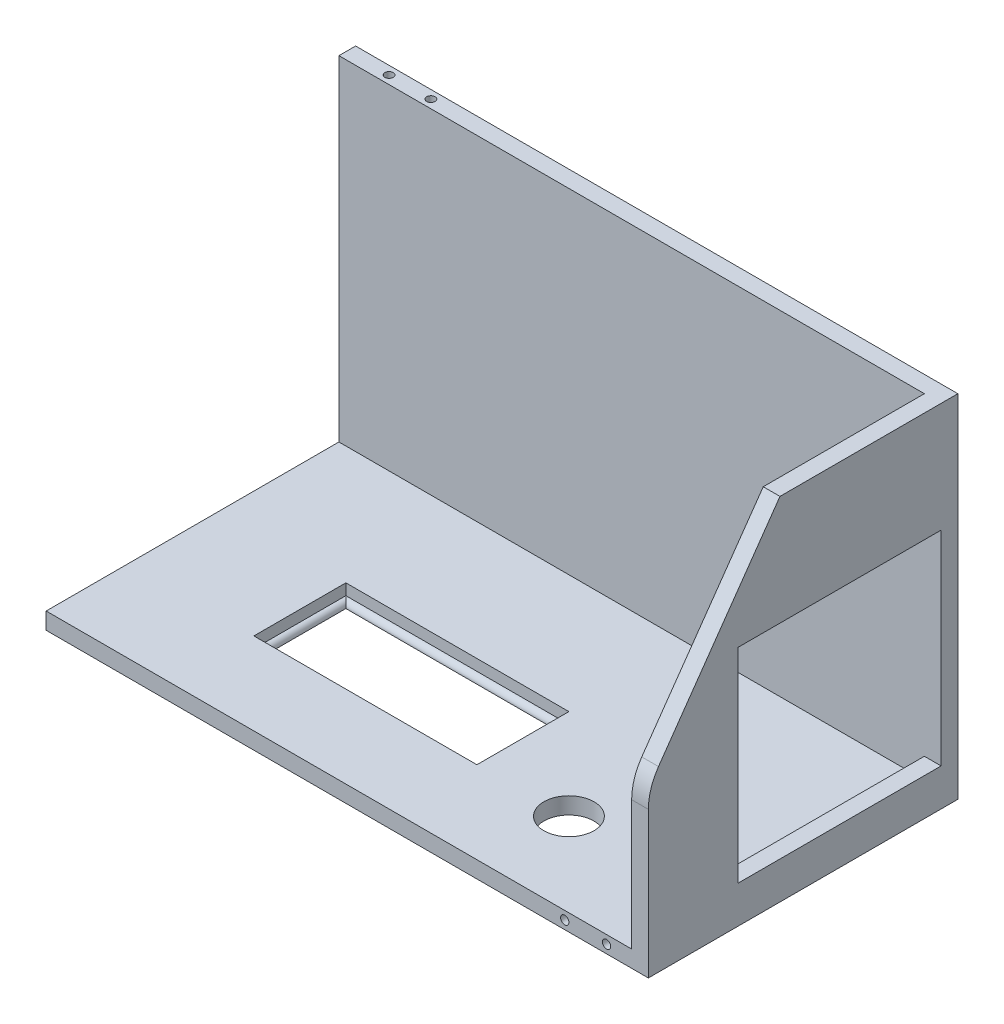
ISO-10303-21;
HEADER;
FILE_DESCRIPTION(('STEP AP214'),'2;1');
FILE_NAME('part.step','',(''),(''),'','','');
FILE_SCHEMA(('AUTOMOTIVE_DESIGN { 1 0 10303 214 1 1 1 1 }'));
ENDSEC;
DATA;
#1=APPLICATION_CONTEXT('core data for automotive mechanical design processes');
#2=APPLICATION_PROTOCOL_DEFINITION('international standard','automotive_design',2000,#1);
#3=PRODUCT_CONTEXT('',#1,'mechanical');
#4=PRODUCT('Part','Part','',(#3));
#5=PRODUCT_RELATED_PRODUCT_CATEGORY('part','',(#4));
#6=PRODUCT_DEFINITION_FORMATION('','',#4);
#7=PRODUCT_DEFINITION_CONTEXT('part definition',#1,'design');
#8=PRODUCT_DEFINITION('design','',#6,#7);
#9=PRODUCT_DEFINITION_SHAPE('','',#8);
#10=(LENGTH_UNIT() NAMED_UNIT(*) SI_UNIT(.MILLI.,.METRE.));
#11=(NAMED_UNIT(*) PLANE_ANGLE_UNIT() SI_UNIT($,.RADIAN.));
#12=(NAMED_UNIT(*) SI_UNIT($,.STERADIAN.) SOLID_ANGLE_UNIT());
#13=UNCERTAINTY_MEASURE_WITH_UNIT(LENGTH_MEASURE(1.E-05),#10,'distance_accuracy_value','');
#14=(GEOMETRIC_REPRESENTATION_CONTEXT(3) GLOBAL_UNCERTAINTY_ASSIGNED_CONTEXT((#13)) GLOBAL_UNIT_ASSIGNED_CONTEXT((#10,
#11,#12)) REPRESENTATION_CONTEXT('',''));
#15=CARTESIAN_POINT('',(0.,0.,0.));
#16=DIRECTION('',(0.,0.,1.));
#17=DIRECTION('',(1.,0.,0.));
#18=AXIS2_PLACEMENT_3D('',#15,#16,#17);
#19=CARTESIAN_POINT('',(0.,6.,-105.));
#20=DIRECTION('',(1.,0.,0.));
#21=DIRECTION('',(0.,0.,-1.));
#22=AXIS2_PLACEMENT_3D('',#19,#20,#21);
#23=PLANE('',#22);
#24=DIRECTION('',(0.,0.,1.));
#25=VECTOR('',#24,1.);
#26=CARTESIAN_POINT('',(0.,0.,-105.));
#27=LINE('',#26,#25);
#28=CARTESIAN_POINT('',(0.,0.,-111.));
#29=VERTEX_POINT('',#28);
#30=CARTESIAN_POINT('',(0.,0.,0.));
#31=VERTEX_POINT('',#30);
#32=EDGE_CURVE('E233',#29,#31,#27,.T.);
#33=ORIENTED_EDGE('',*,*,#32,.T.);
#34=DIRECTION('',(0.,-1.,0.));
#35=VECTOR('',#34,1.);
#36=CARTESIAN_POINT('',(0.,6.,0.));
#37=LINE('',#36,#35);
#38=CARTESIAN_POINT('',(0.,6.,0.));
#39=VERTEX_POINT('',#38);
#40=EDGE_CURVE('E217',#39,#31,#37,.T.);
#41=ORIENTED_EDGE('',*,*,#40,.F.);
#42=DIRECTION('',(0.,0.,1.));
#43=VECTOR('',#42,1.);
#44=CARTESIAN_POINT('',(0.,6.,-105.));
#45=LINE('',#44,#43);
#46=CARTESIAN_POINT('',(0.,6.,-105.));
#47=VERTEX_POINT('',#46);
#48=EDGE_CURVE('E232',#47,#39,#45,.T.);
#49=ORIENTED_EDGE('',*,*,#48,.F.);
#50=DIRECTION('',(0.,-1.,0.));
#51=VECTOR('',#50,1.);
#52=CARTESIAN_POINT('',(0.,126.,-105.));
#53=LINE('',#52,#51);
#54=CARTESIAN_POINT('',(0.,126.,-105.));
#55=VERTEX_POINT('',#54);
#56=EDGE_CURVE('E237',#55,#47,#53,.T.);
#57=ORIENTED_EDGE('',*,*,#56,.F.);
#58=DIRECTION('',(0.,0.,-1.));
#59=VECTOR('',#58,1.);
#60=CARTESIAN_POINT('',(0.,126.,-111.));
#61=LINE('',#60,#59);
#62=CARTESIAN_POINT('',(0.,126.,-111.));
#63=VERTEX_POINT('',#62);
#64=EDGE_CURVE('E267',#55,#63,#61,.T.);
#65=ORIENTED_EDGE('',*,*,#64,.T.);
#66=DIRECTION('',(0.,-1.,0.));
#67=VECTOR('',#66,1.);
#68=CARTESIAN_POINT('',(0.,126.,-111.));
#69=LINE('',#68,#67);
#70=EDGE_CURVE('E252',#63,#29,#69,.T.);
#71=ORIENTED_EDGE('',*,*,#70,.T.);
#72=EDGE_LOOP('',(#33,#41,#49,#57,#65,#71));
#73=FACE_BOUND('',#72,.T.);
#74=ADVANCED_FACE('F38',(#73),#23,.F.);
#75=CARTESIAN_POINT('',(0.,6.,0.));
#76=DIRECTION('',(0.,0.,-1.));
#77=DIRECTION('',(-1.,0.,0.));
#78=AXIS2_PLACEMENT_3D('',#75,#76,#77);
#79=PLANE('',#78);
#80=CARTESIAN_POINT('',(201.,3.,0.));
#81=DIRECTION('',(0.,0.,1.));
#82=DIRECTION('',(1.,0.,0.));
#83=AXIS2_PLACEMENT_3D('',#80,#81,#82);
#84=CIRCLE('',#83,1.5);
#85=CARTESIAN_POINT('',(202.5,3.,0.));
#86=VERTEX_POINT('',#85);
#87=EDGE_CURVE('E402',#86,#86,#84,.T.);
#88=ORIENTED_EDGE('',*,*,#87,.F.);
#89=EDGE_LOOP('',(#88));
#90=FACE_BOUND('',#89,.T.);
#91=CARTESIAN_POINT('',(186.,3.,0.));
#92=DIRECTION('',(0.,0.,1.));
#93=DIRECTION('',(1.,0.,0.));
#94=AXIS2_PLACEMENT_3D('',#91,#92,#93);
#95=CIRCLE('',#94,1.5);
#96=CARTESIAN_POINT('',(187.5,3.,0.));
#97=VERTEX_POINT('',#96);
#98=EDGE_CURVE('E393',#97,#97,#95,.T.);
#99=ORIENTED_EDGE('',*,*,#98,.F.);
#100=EDGE_LOOP('',(#99));
#101=FACE_BOUND('',#100,.T.);
#102=DIRECTION('',(0.,-1.,0.));
#103=VECTOR('',#102,1.);
#104=CARTESIAN_POINT('',(216.,126.,0.));
#105=LINE('',#104,#103);
#106=CARTESIAN_POINT('',(216.,52.3856932324828,0.));
#107=VERTEX_POINT('',#106);
#108=CARTESIAN_POINT('',(216.,0.,0.));
#109=VERTEX_POINT('',#108);
#110=EDGE_CURVE('E290',#107,#109,#105,.T.);
#111=ORIENTED_EDGE('',*,*,#110,.F.);
#112=DIRECTION('',(1.,0.,0.));
#113=VECTOR('',#112,1.);
#114=CARTESIAN_POINT('',(0.,52.3856932324828,0.));
#115=LINE('',#114,#113);
#116=CARTESIAN_POINT('',(210.,52.3856932324828,0.));
#117=VERTEX_POINT('',#116);
#118=EDGE_CURVE('E48',#107,#117,#115,.F.);
#119=ORIENTED_EDGE('',*,*,#118,.T.);
#120=DIRECTION('',(0.,-1.,0.));
#121=VECTOR('',#120,1.);
#122=CARTESIAN_POINT('',(210.,126.,0.));
#123=LINE('',#122,#121);
#124=CARTESIAN_POINT('',(210.,6.00000000000001,0.));
#125=VERTEX_POINT('',#124);
#126=EDGE_CURVE('E278',#117,#125,#123,.T.);
#127=ORIENTED_EDGE('',*,*,#126,.T.);
#128=DIRECTION('',(1.,0.,0.));
#129=VECTOR('',#128,1.);
#130=CARTESIAN_POINT('',(0.,6.,0.));
#131=LINE('',#130,#129);
#132=EDGE_CURVE('E245',#39,#125,#131,.T.);
#133=ORIENTED_EDGE('',*,*,#132,.F.);
#134=ORIENTED_EDGE('',*,*,#40,.T.);
#135=DIRECTION('',(1.,0.,0.));
#136=VECTOR('',#135,1.);
#137=CARTESIAN_POINT('',(0.,0.,0.));
#138=LINE('',#137,#136);
#139=EDGE_CURVE('E228',#31,#109,#138,.T.);
#140=ORIENTED_EDGE('',*,*,#139,.T.);
#141=EDGE_LOOP('',(#111,#119,#127,#133,#134,#140));
#142=FACE_BOUND('',#141,.T.);
#143=ADVANCED_FACE('F488',(#90,#101,#142),#79,.F.);
#144=CARTESIAN_POINT('',(0.,6.,0.));
#145=DIRECTION('',(0.,1.,0.));
#146=DIRECTION('',(0.,0.,1.));
#147=AXIS2_PLACEMENT_3D('',#144,#145,#146);
#148=PLANE('',#147);
#149=DIRECTION('',(1.,0.,0.));
#150=VECTOR('',#149,1.);
#151=CARTESIAN_POINT('',(45.,6.,-29.5));
#152=LINE('',#151,#150);
#153=CARTESIAN_POINT('',(45.,6.,-29.5));
#154=VERTEX_POINT('',#153);
#155=CARTESIAN_POINT('',(125.,6.,-29.5));
#156=VERTEX_POINT('',#155);
#157=EDGE_CURVE('E375',#154,#156,#152,.T.);
#158=ORIENTED_EDGE('',*,*,#157,.F.);
#159=DIRECTION('',(0.,0.,1.));
#160=VECTOR('',#159,1.);
#161=CARTESIAN_POINT('',(45.,6.,-62.5));
#162=LINE('',#161,#160);
#163=CARTESIAN_POINT('',(45.,6.,-62.5));
#164=VERTEX_POINT('',#163);
#165=EDGE_CURVE('E356',#164,#154,#162,.T.);
#166=ORIENTED_EDGE('',*,*,#165,.F.);
#167=DIRECTION('',(-1.,0.,0.));
#168=VECTOR('',#167,1.);
#169=CARTESIAN_POINT('',(125.,6.,-62.5));
#170=LINE('',#169,#168);
#171=CARTESIAN_POINT('',(125.,6.,-62.5));
#172=VERTEX_POINT('',#171);
#173=EDGE_CURVE('E367',#172,#164,#170,.T.);
#174=ORIENTED_EDGE('',*,*,#173,.F.);
#175=DIRECTION('',(0.,0.,-1.));
#176=VECTOR('',#175,1.);
#177=CARTESIAN_POINT('',(125.,6.,-62.5));
#178=LINE('',#177,#176);
#179=EDGE_CURVE('E371',#156,#172,#178,.T.);
#180=ORIENTED_EDGE('',*,*,#179,.F.);
#181=EDGE_LOOP('',(#158,#166,#174,#180));
#182=FACE_BOUND('',#181,.T.);
#183=CARTESIAN_POINT('',(157.5,6.,-30.));
#184=DIRECTION('',(0.,1.,0.));
#185=DIRECTION('',(0.,0.,1.));
#186=AXIS2_PLACEMENT_3D('',#183,#184,#185);
#187=CIRCLE('',#186,9.00000000000001);
#188=CARTESIAN_POINT('',(157.5,6.,-21.));
#189=VERTEX_POINT('',#188);
#190=EDGE_CURVE('E223',#189,#189,#187,.T.);
#191=ORIENTED_EDGE('',*,*,#190,.F.);
#192=EDGE_LOOP('',(#191));
#193=FACE_BOUND('',#192,.T.);
#194=ORIENTED_EDGE('',*,*,#48,.T.);
#195=ORIENTED_EDGE('',*,*,#132,.T.);
#196=DIRECTION('',(0.,0.,-1.));
#197=VECTOR('',#196,1.);
#198=CARTESIAN_POINT('',(210.,6.,0.));
#199=LINE('',#198,#197);
#200=CARTESIAN_POINT('',(210.,6.00000000000001,-105.));
#201=VERTEX_POINT('',#200);
#202=EDGE_CURVE('E241',#125,#201,#199,.T.);
#203=ORIENTED_EDGE('',*,*,#202,.T.);
#204=DIRECTION('',(-1.,0.,0.));
#205=VECTOR('',#204,1.);
#206=CARTESIAN_POINT('',(210.,6.,-105.));
#207=LINE('',#206,#205);
#208=EDGE_CURVE('E227',#201,#47,#207,.T.);
#209=ORIENTED_EDGE('',*,*,#208,.T.);
#210=EDGE_LOOP('',(#194,#195,#203,#209));
#211=FACE_BOUND('',#210,.T.);
#212=ADVANCED_FACE('F465',(#182,#193,#211),#148,.T.);
#213=CARTESIAN_POINT('',(0.,0.,0.));
#214=DIRECTION('',(0.,1.,0.));
#215=DIRECTION('',(0.,0.,1.));
#216=AXIS2_PLACEMENT_3D('',#213,#214,#215);
#217=PLANE('',#216);
#218=CARTESIAN_POINT('',(157.5,0.,-30.));
#219=DIRECTION('',(0.,1.,0.));
#220=DIRECTION('',(0.,0.,1.));
#221=AXIS2_PLACEMENT_3D('',#218,#219,#220);
#222=CIRCLE('',#221,9.00000000000001);
#223=CARTESIAN_POINT('',(157.5,0.,-21.));
#224=VERTEX_POINT('',#223);
#225=EDGE_CURVE('E218',#224,#224,#222,.T.);
#226=ORIENTED_EDGE('',*,*,#225,.T.);
#227=EDGE_LOOP('',(#226));
#228=FACE_BOUND('',#227,.T.);
#229=ORIENTED_EDGE('',*,*,#32,.F.);
#230=DIRECTION('',(1.,0.,0.));
#231=VECTOR('',#230,1.);
#232=CARTESIAN_POINT('',(210.,0.,-111.));
#233=LINE('',#232,#231);
#234=CARTESIAN_POINT('',(216.,0.,-111.));
#235=VERTEX_POINT('',#234);
#236=EDGE_CURVE('E264',#29,#235,#233,.T.);
#237=ORIENTED_EDGE('',*,*,#236,.T.);
#238=DIRECTION('',(0.,0.,-1.));
#239=VECTOR('',#238,1.);
#240=CARTESIAN_POINT('',(216.,0.,0.));
#241=LINE('',#240,#239);
#242=EDGE_CURVE('E268',#109,#235,#241,.T.);
#243=ORIENTED_EDGE('',*,*,#242,.F.);
#244=ORIENTED_EDGE('',*,*,#139,.F.);
#245=EDGE_LOOP('',(#229,#237,#243,#244));
#246=FACE_BOUND('',#245,.T.);
#247=DIRECTION('',(1.,0.,0.));
#248=VECTOR('',#247,1.);
#249=CARTESIAN_POINT('',(123.,0.,-60.5));
#250=LINE('',#249,#248);
#251=CARTESIAN_POINT('',(47.,0.,-60.5));
#252=VERTEX_POINT('',#251);
#253=CARTESIAN_POINT('',(123.,0.,-60.5));
#254=VERTEX_POINT('',#253);
#255=EDGE_CURVE('E175',#252,#254,#250,.T.);
#256=ORIENTED_EDGE('',*,*,#255,.F.);
#257=DIRECTION('',(0.,0.,-1.));
#258=VECTOR('',#257,1.);
#259=CARTESIAN_POINT('',(47.,0.,-60.5));
#260=LINE('',#259,#258);
#261=CARTESIAN_POINT('',(47.,0.,-31.5));
#262=VERTEX_POINT('',#261);
#263=EDGE_CURVE('E191',#262,#252,#260,.T.);
#264=ORIENTED_EDGE('',*,*,#263,.F.);
#265=DIRECTION('',(-1.,0.,0.));
#266=VECTOR('',#265,1.);
#267=CARTESIAN_POINT('',(47.,0.,-31.5));
#268=LINE('',#267,#266);
#269=CARTESIAN_POINT('',(123.,0.,-31.5));
#270=VERTEX_POINT('',#269);
#271=EDGE_CURVE('E178',#270,#262,#268,.T.);
#272=ORIENTED_EDGE('',*,*,#271,.F.);
#273=DIRECTION('',(0.,0.,1.));
#274=VECTOR('',#273,1.);
#275=CARTESIAN_POINT('',(123.,0.,-31.5));
#276=LINE('',#275,#274);
#277=EDGE_CURVE('E172',#254,#270,#276,.T.);
#278=ORIENTED_EDGE('',*,*,#277,.F.);
#279=EDGE_LOOP('',(#256,#264,#272,#278));
#280=FACE_BOUND('',#279,.T.);
#281=ADVANCED_FACE('F174',(#228,#246,#280),#217,.F.);
#282=CARTESIAN_POINT('',(0.,126.,-105.));
#283=DIRECTION('',(0.,0.,1.));
#284=DIRECTION('',(1.,0.,0.));
#285=AXIS2_PLACEMENT_3D('',#282,#283,#284);
#286=PLANE('',#285);
#287=DIRECTION('',(0.,-1.,0.));
#288=VECTOR('',#287,1.);
#289=CARTESIAN_POINT('',(210.,126.,-105.));
#290=LINE('',#289,#288);
#291=CARTESIAN_POINT('',(210.,13.375,-105.));
#292=VERTEX_POINT('',#291);
#293=EDGE_CURVE('E256',#292,#201,#290,.T.);
#294=ORIENTED_EDGE('',*,*,#293,.F.);
#295=DIRECTION('',(1.,0.,0.));
#296=VECTOR('',#295,1.);
#297=CARTESIAN_POINT('',(192.,13.375,-105.));
#298=LINE('',#297,#296);
#299=CARTESIAN_POINT('',(216.,13.375,-105.));
#300=VERTEX_POINT('',#299);
#301=EDGE_CURVE('E332',#292,#300,#298,.T.);
#302=ORIENTED_EDGE('',*,*,#301,.T.);
#303=DIRECTION('',(0.,1.,0.));
#304=VECTOR('',#303,1.);
#305=CARTESIAN_POINT('',(216.,86.625,-105.));
#306=LINE('',#305,#304);
#307=CARTESIAN_POINT('',(216.,86.625,-105.));
#308=VERTEX_POINT('',#307);
#309=EDGE_CURVE('E329',#300,#308,#306,.T.);
#310=ORIENTED_EDGE('',*,*,#309,.T.);
#311=DIRECTION('',(1.,0.,0.));
#312=VECTOR('',#311,1.);
#313=CARTESIAN_POINT('',(192.,86.625,-105.));
#314=LINE('',#313,#312);
#315=CARTESIAN_POINT('',(210.,86.625,-105.));
#316=VERTEX_POINT('',#315);
#317=EDGE_CURVE('E323',#316,#308,#314,.T.);
#318=ORIENTED_EDGE('',*,*,#317,.F.);
#319=CARTESIAN_POINT('',(210.,126.,-105.));
#320=VERTEX_POINT('',#319);
#321=EDGE_CURVE('E258',#320,#316,#290,.T.);
#322=ORIENTED_EDGE('',*,*,#321,.F.);
#323=DIRECTION('',(-1.,0.,0.));
#324=VECTOR('',#323,1.);
#325=CARTESIAN_POINT('',(0.,126.,-105.));
#326=LINE('',#325,#324);
#327=EDGE_CURVE('E257',#320,#55,#326,.T.);
#328=ORIENTED_EDGE('',*,*,#327,.T.);
#329=ORIENTED_EDGE('',*,*,#56,.T.);
#330=ORIENTED_EDGE('',*,*,#208,.F.);
#331=EDGE_LOOP('',(#294,#302,#310,#318,#322,#328,#329,#330));
#332=FACE_BOUND('',#331,.T.);
#333=ADVANCED_FACE('F462',(#332),#286,.T.);
#334=CARTESIAN_POINT('',(210.,126.,-111.));
#335=DIRECTION('',(0.,0.,-1.));
#336=DIRECTION('',(-1.,0.,0.));
#337=AXIS2_PLACEMENT_3D('',#334,#335,#336);
#338=PLANE('',#337);
#339=ORIENTED_EDGE('',*,*,#236,.F.);
#340=ORIENTED_EDGE('',*,*,#70,.F.);
#341=DIRECTION('',(1.,0.,0.));
#342=VECTOR('',#341,1.);
#343=CARTESIAN_POINT('',(210.,126.,-111.));
#344=LINE('',#343,#342);
#345=CARTESIAN_POINT('',(216.,126.,-111.));
#346=VERTEX_POINT('',#345);
#347=EDGE_CURVE('E272',#63,#346,#344,.T.);
#348=ORIENTED_EDGE('',*,*,#347,.T.);
#349=DIRECTION('',(0.,1.,0.));
#350=VECTOR('',#349,1.);
#351=CARTESIAN_POINT('',(216.,0.,-111.));
#352=LINE('',#351,#350);
#353=EDGE_CURVE('E281',#235,#346,#352,.T.);
#354=ORIENTED_EDGE('',*,*,#353,.F.);
#355=EDGE_LOOP('',(#339,#340,#348,#354));
#356=FACE_BOUND('',#355,.T.);
#357=ADVANCED_FACE('F438',(#356),#338,.T.);
#358=CARTESIAN_POINT('',(0.,126.,0.));
#359=DIRECTION('',(0.,1.,0.));
#360=DIRECTION('',(0.,0.,1.));
#361=AXIS2_PLACEMENT_3D('',#358,#359,#360);
#362=PLANE('',#361);
#363=CARTESIAN_POINT('',(15.,126.,-108.));
#364=DIRECTION('',(0.,1.,0.));
#365=DIRECTION('',(0.,0.,1.));
#366=AXIS2_PLACEMENT_3D('',#363,#364,#365);
#367=CIRCLE('',#366,1.5);
#368=CARTESIAN_POINT('',(15.,126.,-106.5));
#369=VERTEX_POINT('',#368);
#370=EDGE_CURVE('E417',#369,#369,#367,.T.);
#371=ORIENTED_EDGE('',*,*,#370,.F.);
#372=EDGE_LOOP('',(#371));
#373=FACE_BOUND('',#372,.T.);
#374=CARTESIAN_POINT('',(30.,126.,-108.));
#375=DIRECTION('',(0.,1.,0.));
#376=DIRECTION('',(0.,0.,1.));
#377=AXIS2_PLACEMENT_3D('',#374,#375,#376);
#378=CIRCLE('',#377,1.5);
#379=CARTESIAN_POINT('',(30.,126.,-106.5));
#380=VERTEX_POINT('',#379);
#381=EDGE_CURVE('E409',#380,#380,#378,.T.);
#382=ORIENTED_EDGE('',*,*,#381,.F.);
#383=EDGE_LOOP('',(#382));
#384=FACE_BOUND('',#383,.T.);
#385=DIRECTION('',(1.,0.,0.));
#386=VECTOR('',#385,1.);
#387=CARTESIAN_POINT('',(210.,126.,-47.2));
#388=LINE('',#387,#386);
#389=CARTESIAN_POINT('',(210.,126.,-47.2));
#390=VERTEX_POINT('',#389);
#391=CARTESIAN_POINT('',(216.,126.,-47.2));
#392=VERTEX_POINT('',#391);
#393=EDGE_CURVE('E286',#390,#392,#388,.T.);
#394=ORIENTED_EDGE('',*,*,#393,.T.);
#395=DIRECTION('',(0.,0.,1.));
#396=VECTOR('',#395,1.);
#397=CARTESIAN_POINT('',(216.,126.,-111.));
#398=LINE('',#397,#396);
#399=EDGE_CURVE('E293',#346,#392,#398,.T.);
#400=ORIENTED_EDGE('',*,*,#399,.F.);
#401=ORIENTED_EDGE('',*,*,#347,.F.);
#402=ORIENTED_EDGE('',*,*,#64,.F.);
#403=ORIENTED_EDGE('',*,*,#327,.F.);
#404=DIRECTION('',(0.,0.,1.));
#405=VECTOR('',#404,1.);
#406=CARTESIAN_POINT('',(210.,126.,-111.));
#407=LINE('',#406,#405);
#408=EDGE_CURVE('E282',#320,#390,#407,.T.);
#409=ORIENTED_EDGE('',*,*,#408,.T.);
#410=EDGE_LOOP('',(#394,#400,#401,#402,#403,#409));
#411=FACE_BOUND('',#410,.T.);
#412=ADVANCED_FACE('F434',(#373,#384,#411),#362,.T.);
#413=CARTESIAN_POINT('',(210.,0.,0.));
#414=DIRECTION('',(1.,0.,0.));
#415=DIRECTION('',(0.,0.,-1.));
#416=AXIS2_PLACEMENT_3D('',#413,#414,#415);
#417=PLANE('',#416);
#418=ORIENTED_EDGE('',*,*,#126,.F.);
#419=CARTESIAN_POINT('',(210.,52.3856932324828,-20.));
#420=DIRECTION('',(1.,0.,0.));
#421=DIRECTION('',(0.,0.,-1.));
#422=AXIS2_PLACEMENT_3D('',#419,#420,#421);
#423=CIRCLE('',#422,20.);
#424=CARTESIAN_POINT('',(210.,63.8696317076854,-3.62565552158616));
#425=VERTEX_POINT('',#424);
#426=EDGE_CURVE('E11',#117,#425,#423,.F.);
#427=ORIENTED_EDGE('',*,*,#426,.T.);
#428=DIRECTION('',(0.,0.818717223920692,-0.574196923760129));
#429=VECTOR('',#428,1.);
#430=CARTESIAN_POINT('',(210.,58.7,0.));
#431=LINE('',#430,#429);
#432=EDGE_CURVE('E303',#425,#390,#431,.T.);
#433=ORIENTED_EDGE('',*,*,#432,.T.);
#434=ORIENTED_EDGE('',*,*,#408,.F.);
#435=ORIENTED_EDGE('',*,*,#321,.T.);
#436=DIRECTION('',(0.,0.,1.));
#437=VECTOR('',#436,1.);
#438=CARTESIAN_POINT('',(210.,86.625,0.));
#439=LINE('',#438,#437);
#440=CARTESIAN_POINT('',(210.,86.625,-32.2));
#441=VERTEX_POINT('',#440);
#442=EDGE_CURVE('E311',#316,#441,#439,.T.);
#443=ORIENTED_EDGE('',*,*,#442,.T.);
#444=DIRECTION('',(0.,-1.,0.));
#445=VECTOR('',#444,1.);
#446=CARTESIAN_POINT('',(210.,0.,-32.2000000000001));
#447=LINE('',#446,#445);
#448=CARTESIAN_POINT('',(210.,13.375,-32.2000000000001));
#449=VERTEX_POINT('',#448);
#450=EDGE_CURVE('E319',#441,#449,#447,.T.);
#451=ORIENTED_EDGE('',*,*,#450,.T.);
#452=DIRECTION('',(0.,0.,-1.));
#453=VECTOR('',#452,1.);
#454=CARTESIAN_POINT('',(210.,13.375,0.));
#455=LINE('',#454,#453);
#456=EDGE_CURVE('E315',#449,#292,#455,.T.);
#457=ORIENTED_EDGE('',*,*,#456,.T.);
#458=ORIENTED_EDGE('',*,*,#293,.T.);
#459=ORIENTED_EDGE('',*,*,#202,.F.);
#460=EDGE_LOOP('',(#418,#427,#433,#434,#435,#443,#451,#457,#458,#459));
#461=FACE_BOUND('',#460,.T.);
#462=ADVANCED_FACE('F437',(#461),#417,.F.);
#463=CARTESIAN_POINT('',(216.,0.,0.));
#464=DIRECTION('',(1.,0.,0.));
#465=DIRECTION('',(0.,0.,-1.));
#466=AXIS2_PLACEMENT_3D('',#463,#464,#465);
#467=PLANE('',#466);
#468=DIRECTION('',(0.,0.,1.));
#469=VECTOR('',#468,1.);
#470=CARTESIAN_POINT('',(216.,86.625,-105.));
#471=LINE('',#470,#469);
#472=CARTESIAN_POINT('',(216.,86.625,-32.2));
#473=VERTEX_POINT('',#472);
#474=EDGE_CURVE('E348',#308,#473,#471,.T.);
#475=ORIENTED_EDGE('',*,*,#474,.F.);
#476=ORIENTED_EDGE('',*,*,#309,.F.);
#477=DIRECTION('',(0.,0.,-1.));
#478=VECTOR('',#477,1.);
#479=CARTESIAN_POINT('',(216.,13.375,-32.2000000000001));
#480=LINE('',#479,#478);
#481=CARTESIAN_POINT('',(216.,13.375,-32.2000000000001));
#482=VERTEX_POINT('',#481);
#483=EDGE_CURVE('E340',#482,#300,#480,.T.);
#484=ORIENTED_EDGE('',*,*,#483,.F.);
#485=DIRECTION('',(0.,-1.,0.));
#486=VECTOR('',#485,1.);
#487=CARTESIAN_POINT('',(216.,86.625,-32.2));
#488=LINE('',#487,#486);
#489=EDGE_CURVE('E344',#473,#482,#488,.T.);
#490=ORIENTED_EDGE('',*,*,#489,.F.);
#491=EDGE_LOOP('',(#475,#476,#484,#490));
#492=FACE_BOUND('',#491,.T.);
#493=DIRECTION('',(0.,0.818717223920692,-0.574196923760129));
#494=VECTOR('',#493,1.);
#495=CARTESIAN_POINT('',(216.,58.7,0.));
#496=LINE('',#495,#494);
#497=CARTESIAN_POINT('',(216.,63.8696317076854,-3.62565552158616));
#498=VERTEX_POINT('',#497);
#499=EDGE_CURVE('E222',#498,#392,#496,.T.);
#500=ORIENTED_EDGE('',*,*,#499,.F.);
#501=CARTESIAN_POINT('',(216.,52.3856932324828,-20.));
#502=DIRECTION('',(1.,0.,0.));
#503=DIRECTION('',(0.,0.,-1.));
#504=AXIS2_PLACEMENT_3D('',#501,#502,#503);
#505=CIRCLE('',#504,20.);
#506=EDGE_CURVE('E210',#498,#107,#505,.T.);
#507=ORIENTED_EDGE('',*,*,#506,.T.);
#508=ORIENTED_EDGE('',*,*,#110,.T.);
#509=ORIENTED_EDGE('',*,*,#242,.T.);
#510=ORIENTED_EDGE('',*,*,#353,.T.);
#511=ORIENTED_EDGE('',*,*,#399,.T.);
#512=EDGE_LOOP('',(#500,#507,#508,#509,#510,#511));
#513=FACE_BOUND('',#512,.T.);
#514=ADVANCED_FACE('F450',(#492,#513),#467,.T.);
#515=CARTESIAN_POINT('',(210.,58.7,0.));
#516=DIRECTION('',(0.,-0.574196923760129,-0.818717223920692));
#517=DIRECTION('',(0.,0.818717223920692,-0.574196923760129));
#518=AXIS2_PLACEMENT_3D('',#515,#516,#517);
#519=PLANE('',#518);
#520=ORIENTED_EDGE('',*,*,#432,.F.);
#521=DIRECTION('',(1.,0.,0.));
#522=VECTOR('',#521,1.);
#523=CARTESIAN_POINT('',(210.,63.8696317076854,-3.62565552158616));
#524=LINE('',#523,#522);
#525=EDGE_CURVE('E213',#425,#498,#524,.T.);
#526=ORIENTED_EDGE('',*,*,#525,.T.);
#527=ORIENTED_EDGE('',*,*,#499,.T.);
#528=ORIENTED_EDGE('',*,*,#393,.F.);
#529=EDGE_LOOP('',(#520,#526,#527,#528));
#530=FACE_BOUND('',#529,.T.);
#531=ADVANCED_FACE('F485',(#530),#519,.F.);
#532=CARTESIAN_POINT('',(157.5,-18.,-30.));
#533=DIRECTION('',(0.,1.,0.));
#534=DIRECTION('',(0.,0.,1.));
#535=AXIS2_PLACEMENT_3D('',#532,#533,#534);
#536=CYLINDRICAL_SURFACE('',#535,9.00000000000001);
#537=ORIENTED_EDGE('',*,*,#190,.T.);
#538=EDGE_LOOP('',(#537));
#539=FACE_BOUND('',#538,.T.);
#540=ORIENTED_EDGE('',*,*,#225,.F.);
#541=EDGE_LOOP('',(#540));
#542=FACE_BOUND('',#541,.T.);
#543=ADVANCED_FACE('F578',(#539,#542),#536,.F.);
#544=CARTESIAN_POINT('',(192.,86.625,-105.));
#545=DIRECTION('',(0.,1.,0.));
#546=DIRECTION('',(0.,0.,1.));
#547=AXIS2_PLACEMENT_3D('',#544,#545,#546);
#548=PLANE('',#547);
#549=ORIENTED_EDGE('',*,*,#317,.T.);
#550=ORIENTED_EDGE('',*,*,#474,.T.);
#551=DIRECTION('',(1.,0.,0.));
#552=VECTOR('',#551,1.);
#553=CARTESIAN_POINT('',(192.,86.625,-32.2));
#554=LINE('',#553,#552);
#555=EDGE_CURVE('E324',#441,#473,#554,.T.);
#556=ORIENTED_EDGE('',*,*,#555,.F.);
#557=ORIENTED_EDGE('',*,*,#442,.F.);
#558=EDGE_LOOP('',(#549,#550,#556,#557));
#559=FACE_BOUND('',#558,.T.);
#560=ADVANCED_FACE('F481',(#559),#548,.F.);
#561=CARTESIAN_POINT('',(192.,13.375,-32.2000000000001));
#562=DIRECTION('',(0.,-1.,0.));
#563=DIRECTION('',(0.,0.,-1.));
#564=AXIS2_PLACEMENT_3D('',#561,#562,#563);
#565=PLANE('',#564);
#566=DIRECTION('',(1.,0.,0.));
#567=VECTOR('',#566,1.);
#568=CARTESIAN_POINT('',(192.,13.375,-32.2000000000001));
#569=LINE('',#568,#567);
#570=EDGE_CURVE('E328',#449,#482,#569,.T.);
#571=ORIENTED_EDGE('',*,*,#570,.T.);
#572=ORIENTED_EDGE('',*,*,#483,.T.);
#573=ORIENTED_EDGE('',*,*,#301,.F.);
#574=ORIENTED_EDGE('',*,*,#456,.F.);
#575=EDGE_LOOP('',(#571,#572,#573,#574));
#576=FACE_BOUND('',#575,.T.);
#577=ADVANCED_FACE('F476',(#576),#565,.F.);
#578=CARTESIAN_POINT('',(192.,86.625,-32.2));
#579=DIRECTION('',(0.,0.,1.));
#580=DIRECTION('',(0.,-1.,0.));
#581=AXIS2_PLACEMENT_3D('',#578,#579,#580);
#582=PLANE('',#581);
#583=ORIENTED_EDGE('',*,*,#555,.T.);
#584=ORIENTED_EDGE('',*,*,#489,.T.);
#585=ORIENTED_EDGE('',*,*,#570,.F.);
#586=ORIENTED_EDGE('',*,*,#450,.F.);
#587=EDGE_LOOP('',(#583,#584,#585,#586));
#588=FACE_BOUND('',#587,.T.);
#589=ADVANCED_FACE('F483',(#588),#582,.F.);
#590=CARTESIAN_POINT('',(45.,-18.,-29.5));
#591=DIRECTION('',(0.,0.,1.));
#592=DIRECTION('',(1.,0.,0.));
#593=AXIS2_PLACEMENT_3D('',#590,#591,#592);
#594=PLANE('',#593);
#595=DIRECTION('',(0.,1.,0.));
#596=VECTOR('',#595,1.);
#597=CARTESIAN_POINT('',(125.,-18.,-29.5));
#598=LINE('',#597,#596);
#599=CARTESIAN_POINT('',(125.,2.,-29.5));
#600=VERTEX_POINT('',#599);
#601=EDGE_CURVE('E352',#600,#156,#598,.T.);
#602=ORIENTED_EDGE('',*,*,#601,.F.);
#603=DIRECTION('',(-1.,0.,0.));
#604=VECTOR('',#603,1.);
#605=CARTESIAN_POINT('',(45.,2.,-29.5));
#606=LINE('',#605,#604);
#607=CARTESIAN_POINT('',(45.,2.,-29.5));
#608=VERTEX_POINT('',#607);
#609=EDGE_CURVE('E379',#600,#608,#606,.T.);
#610=ORIENTED_EDGE('',*,*,#609,.T.);
#611=DIRECTION('',(0.,1.,0.));
#612=VECTOR('',#611,1.);
#613=CARTESIAN_POINT('',(45.,-18.,-29.5));
#614=LINE('',#613,#612);
#615=EDGE_CURVE('E351',#608,#154,#614,.T.);
#616=ORIENTED_EDGE('',*,*,#615,.T.);
#617=ORIENTED_EDGE('',*,*,#157,.T.);
#618=EDGE_LOOP('',(#602,#610,#616,#617));
#619=FACE_BOUND('',#618,.T.);
#620=ADVANCED_FACE('F550',(#619),#594,.F.);
#621=CARTESIAN_POINT('',(45.,-18.,-62.5));
#622=DIRECTION('',(-1.,0.,0.));
#623=DIRECTION('',(0.,0.,1.));
#624=AXIS2_PLACEMENT_3D('',#621,#622,#623);
#625=PLANE('',#624);
#626=ORIENTED_EDGE('',*,*,#615,.F.);
#627=DIRECTION('',(0.,0.,-1.));
#628=VECTOR('',#627,1.);
#629=CARTESIAN_POINT('',(45.,2.,-62.5));
#630=LINE('',#629,#628);
#631=CARTESIAN_POINT('',(45.,2.,-62.5));
#632=VERTEX_POINT('',#631);
#633=EDGE_CURVE('E388',#608,#632,#630,.T.);
#634=ORIENTED_EDGE('',*,*,#633,.T.);
#635=DIRECTION('',(0.,1.,0.));
#636=VECTOR('',#635,1.);
#637=CARTESIAN_POINT('',(45.,-18.,-62.5));
#638=LINE('',#637,#636);
#639=EDGE_CURVE('E359',#632,#164,#638,.T.);
#640=ORIENTED_EDGE('',*,*,#639,.T.);
#641=ORIENTED_EDGE('',*,*,#165,.T.);
#642=EDGE_LOOP('',(#626,#634,#640,#641));
#643=FACE_BOUND('',#642,.T.);
#644=ADVANCED_FACE('F542',(#643),#625,.F.);
#645=CARTESIAN_POINT('',(125.,-18.,-62.5));
#646=DIRECTION('',(0.,0.,-1.));
#647=DIRECTION('',(-1.,0.,0.));
#648=AXIS2_PLACEMENT_3D('',#645,#646,#647);
#649=PLANE('',#648);
#650=ORIENTED_EDGE('',*,*,#639,.F.);
#651=DIRECTION('',(1.,0.,0.));
#652=VECTOR('',#651,1.);
#653=CARTESIAN_POINT('',(125.,2.,-62.5));
#654=LINE('',#653,#652);
#655=CARTESIAN_POINT('',(125.,2.,-62.5));
#656=VERTEX_POINT('',#655);
#657=EDGE_CURVE('E385',#632,#656,#654,.T.);
#658=ORIENTED_EDGE('',*,*,#657,.T.);
#659=DIRECTION('',(0.,1.,0.));
#660=VECTOR('',#659,1.);
#661=CARTESIAN_POINT('',(125.,-18.,-62.5));
#662=LINE('',#661,#660);
#663=EDGE_CURVE('E355',#656,#172,#662,.T.);
#664=ORIENTED_EDGE('',*,*,#663,.T.);
#665=ORIENTED_EDGE('',*,*,#173,.T.);
#666=EDGE_LOOP('',(#650,#658,#664,#665));
#667=FACE_BOUND('',#666,.T.);
#668=ADVANCED_FACE('F535',(#667),#649,.F.);
#669=CARTESIAN_POINT('',(125.,-18.,-62.5));
#670=DIRECTION('',(1.,0.,0.));
#671=DIRECTION('',(0.,0.,-1.));
#672=AXIS2_PLACEMENT_3D('',#669,#670,#671);
#673=PLANE('',#672);
#674=ORIENTED_EDGE('',*,*,#663,.F.);
#675=DIRECTION('',(0.,0.,1.));
#676=VECTOR('',#675,1.);
#677=CARTESIAN_POINT('',(125.,2.,-29.5));
#678=LINE('',#677,#676);
#679=EDGE_CURVE('E56',#656,#600,#678,.T.);
#680=ORIENTED_EDGE('',*,*,#679,.T.);
#681=ORIENTED_EDGE('',*,*,#601,.T.);
#682=ORIENTED_EDGE('',*,*,#179,.T.);
#683=EDGE_LOOP('',(#674,#680,#681,#682));
#684=FACE_BOUND('',#683,.T.);
#685=ADVANCED_FACE('F510',(#684),#673,.F.);
#686=CARTESIAN_POINT('',(210.,52.3856932324828,-20.));
#687=DIRECTION('',(1.,0.,0.));
#688=DIRECTION('',(0.,0.,-1.));
#689=AXIS2_PLACEMENT_3D('',#686,#687,#688);
#690=CYLINDRICAL_SURFACE('',#689,20.);
#691=ORIENTED_EDGE('',*,*,#426,.F.);
#692=ORIENTED_EDGE('',*,*,#118,.F.);
#693=ORIENTED_EDGE('',*,*,#506,.F.);
#694=ORIENTED_EDGE('',*,*,#525,.F.);
#695=EDGE_LOOP('',(#691,#692,#693,#694));
#696=FACE_BOUND('',#695,.T.);
#697=ADVANCED_FACE('F487',(#696),#690,.T.);
#698=CARTESIAN_POINT('',(0.,0.,-62.5));
#699=DIRECTION('',(-1.,0.,0.));
#700=DIRECTION('',(0.,0.,1.));
#701=AXIS2_PLACEMENT_3D('',#698,#699,#700);
#702=CYLINDRICAL_SURFACE('',#701,2.);
#703=CARTESIAN_POINT('',(45.,0.,-62.5));
#704=DIRECTION('',(-0.707106781186548,0.,0.707106781186547));
#705=DIRECTION('',(-0.707106781186547,0.,-0.707106781186547));
#706=AXIS2_PLACEMENT_3D('',#703,#704,#705);
#707=ELLIPSE('',#706,2.82842712474619,2.);
#708=EDGE_CURVE('E188',#252,#632,#707,.T.);
#709=ORIENTED_EDGE('',*,*,#708,.F.);
#710=ORIENTED_EDGE('',*,*,#255,.T.);
#711=CARTESIAN_POINT('',(125.,0.,-62.5));
#712=DIRECTION('',(-0.707106781186547,0.,-0.707106781186547));
#713=DIRECTION('',(0.707106781186548,0.,-0.707106781186547));
#714=AXIS2_PLACEMENT_3D('',#711,#712,#713);
#715=ELLIPSE('',#714,2.82842712474619,2.);
#716=EDGE_CURVE('E42',#656,#254,#715,.F.);
#717=ORIENTED_EDGE('',*,*,#716,.F.);
#718=ORIENTED_EDGE('',*,*,#657,.F.);
#719=EDGE_LOOP('',(#709,#710,#717,#718));
#720=FACE_BOUND('',#719,.T.);
#721=ADVANCED_FACE('F40',(#720),#702,.T.);
#722=CARTESIAN_POINT('',(125.,0.,0.));
#723=DIRECTION('',(0.,0.,-1.));
#724=DIRECTION('',(-1.,0.,0.));
#725=AXIS2_PLACEMENT_3D('',#722,#723,#724);
#726=CYLINDRICAL_SURFACE('',#725,2.);
#727=ORIENTED_EDGE('',*,*,#716,.T.);
#728=ORIENTED_EDGE('',*,*,#277,.T.);
#729=CARTESIAN_POINT('',(125.,0.,-29.5));
#730=DIRECTION('',(0.707106781186547,0.,-0.707106781186547));
#731=DIRECTION('',(0.707106781186547,0.,0.707106781186547));
#732=AXIS2_PLACEMENT_3D('',#729,#730,#731);
#733=ELLIPSE('',#732,2.82842712474619,2.);
#734=EDGE_CURVE('E198',#600,#270,#733,.F.);
#735=ORIENTED_EDGE('',*,*,#734,.F.);
#736=ORIENTED_EDGE('',*,*,#679,.F.);
#737=EDGE_LOOP('',(#727,#728,#735,#736));
#738=FACE_BOUND('',#737,.T.);
#739=ADVANCED_FACE('F193',(#738),#726,.T.);
#740=CARTESIAN_POINT('',(45.,0.,0.));
#741=DIRECTION('',(0.,0.,1.));
#742=DIRECTION('',(1.,0.,0.));
#743=AXIS2_PLACEMENT_3D('',#740,#741,#742);
#744=CYLINDRICAL_SURFACE('',#743,2.);
#745=ORIENTED_EDGE('',*,*,#708,.T.);
#746=ORIENTED_EDGE('',*,*,#633,.F.);
#747=CARTESIAN_POINT('',(45.,0.,-29.5));
#748=DIRECTION('',(0.707106781186547,0.,0.707106781186547));
#749=DIRECTION('',(0.707106781186547,0.,-0.707106781186547));
#750=AXIS2_PLACEMENT_3D('',#747,#748,#749);
#751=ELLIPSE('',#750,2.82842712474619,2.);
#752=EDGE_CURVE('E202',#262,#608,#751,.T.);
#753=ORIENTED_EDGE('',*,*,#752,.F.);
#754=ORIENTED_EDGE('',*,*,#263,.T.);
#755=EDGE_LOOP('',(#745,#746,#753,#754));
#756=FACE_BOUND('',#755,.T.);
#757=ADVANCED_FACE('F515',(#756),#744,.T.);
#758=CARTESIAN_POINT('',(0.,0.,-29.5));
#759=DIRECTION('',(1.,0.,0.));
#760=DIRECTION('',(0.,0.,-1.));
#761=AXIS2_PLACEMENT_3D('',#758,#759,#760);
#762=CYLINDRICAL_SURFACE('',#761,2.);
#763=ORIENTED_EDGE('',*,*,#734,.T.);
#764=ORIENTED_EDGE('',*,*,#271,.T.);
#765=ORIENTED_EDGE('',*,*,#752,.T.);
#766=ORIENTED_EDGE('',*,*,#609,.F.);
#767=EDGE_LOOP('',(#763,#764,#765,#766));
#768=FACE_BOUND('',#767,.T.);
#769=ADVANCED_FACE('F511',(#768),#762,.T.);
#770=CARTESIAN_POINT('',(186.,3.,-20.));
#771=DIRECTION('',(0.,0.,1.));
#772=DIRECTION('',(1.,0.,0.));
#773=AXIS2_PLACEMENT_3D('',#770,#771,#772);
#774=CYLINDRICAL_SURFACE('',#773,1.5);
#775=CARTESIAN_POINT('',(186.,3.,-20.));
#776=DIRECTION('',(0.,0.,1.));
#777=DIRECTION('',(1.,0.,0.));
#778=AXIS2_PLACEMENT_3D('',#775,#776,#777);
#779=CIRCLE('',#778,1.5);
#780=CARTESIAN_POINT('',(187.5,3.,-20.));
#781=VERTEX_POINT('',#780);
#782=EDGE_CURVE('E397',#781,#781,#779,.T.);
#783=ORIENTED_EDGE('',*,*,#782,.F.);
#784=EDGE_LOOP('',(#783));
#785=FACE_BOUND('',#784,.T.);
#786=ORIENTED_EDGE('',*,*,#98,.T.);
#787=EDGE_LOOP('',(#786));
#788=FACE_BOUND('',#787,.T.);
#789=ADVANCED_FACE('F514',(#785,#788),#774,.F.);
#790=CARTESIAN_POINT('',(186.,3.,-20.));
#791=DIRECTION('',(0.,0.,1.));
#792=DIRECTION('',(1.,0.,0.));
#793=AXIS2_PLACEMENT_3D('',#790,#791,#792);
#794=PLANE('',#793);
#795=ORIENTED_EDGE('',*,*,#782,.T.);
#796=EDGE_LOOP('',(#795));
#797=FACE_BOUND('',#796,.T.);
#798=ADVANCED_FACE('F677',(#797),#794,.T.);
#799=CARTESIAN_POINT('',(201.,3.,-20.));
#800=DIRECTION('',(0.,0.,1.));
#801=DIRECTION('',(1.,0.,0.));
#802=AXIS2_PLACEMENT_3D('',#799,#800,#801);
#803=CYLINDRICAL_SURFACE('',#802,1.5);
#804=CARTESIAN_POINT('',(201.,3.,-20.));
#805=DIRECTION('',(0.,0.,1.));
#806=DIRECTION('',(1.,0.,0.));
#807=AXIS2_PLACEMENT_3D('',#804,#805,#806);
#808=CIRCLE('',#807,1.5);
#809=CARTESIAN_POINT('',(202.5,3.,-20.));
#810=VERTEX_POINT('',#809);
#811=EDGE_CURVE('E206',#810,#810,#808,.T.);
#812=ORIENTED_EDGE('',*,*,#811,.F.);
#813=EDGE_LOOP('',(#812));
#814=FACE_BOUND('',#813,.T.);
#815=ORIENTED_EDGE('',*,*,#87,.T.);
#816=EDGE_LOOP('',(#815));
#817=FACE_BOUND('',#816,.T.);
#818=ADVANCED_FACE('F686',(#814,#817),#803,.F.);
#819=CARTESIAN_POINT('',(201.,3.,-20.));
#820=DIRECTION('',(0.,0.,1.));
#821=DIRECTION('',(1.,0.,0.));
#822=AXIS2_PLACEMENT_3D('',#819,#820,#821);
#823=PLANE('',#822);
#824=ORIENTED_EDGE('',*,*,#811,.T.);
#825=EDGE_LOOP('',(#824));
#826=FACE_BOUND('',#825,.T.);
#827=ADVANCED_FACE('F695',(#826),#823,.T.);
#828=CARTESIAN_POINT('',(30.,101.,-108.));
#829=DIRECTION('',(0.,1.,0.));
#830=DIRECTION('',(0.,0.,1.));
#831=AXIS2_PLACEMENT_3D('',#828,#829,#830);
#832=CYLINDRICAL_SURFACE('',#831,1.5);
#833=CARTESIAN_POINT('',(30.,101.,-108.));
#834=DIRECTION('',(0.,1.,0.));
#835=DIRECTION('',(0.,0.,1.));
#836=AXIS2_PLACEMENT_3D('',#833,#834,#835);
#837=CIRCLE('',#836,1.5);
#838=CARTESIAN_POINT('',(30.,101.,-106.5));
#839=VERTEX_POINT('',#838);
#840=EDGE_CURVE('E413',#839,#839,#837,.T.);
#841=ORIENTED_EDGE('',*,*,#840,.F.);
#842=EDGE_LOOP('',(#841));
#843=FACE_BOUND('',#842,.T.);
#844=ORIENTED_EDGE('',*,*,#381,.T.);
#845=EDGE_LOOP('',(#844));
#846=FACE_BOUND('',#845,.T.);
#847=ADVANCED_FACE('F703',(#843,#846),#832,.F.);
#848=CARTESIAN_POINT('',(30.,101.,-108.));
#849=DIRECTION('',(0.,1.,0.));
#850=DIRECTION('',(0.,0.,1.));
#851=AXIS2_PLACEMENT_3D('',#848,#849,#850);
#852=PLANE('',#851);
#853=ORIENTED_EDGE('',*,*,#840,.T.);
#854=EDGE_LOOP('',(#853));
#855=FACE_BOUND('',#854,.T.);
#856=ADVANCED_FACE('F430',(#855),#852,.T.);
#857=CARTESIAN_POINT('',(15.,101.,-108.));
#858=DIRECTION('',(0.,1.,0.));
#859=DIRECTION('',(0.,0.,1.));
#860=AXIS2_PLACEMENT_3D('',#857,#858,#859);
#861=CYLINDRICAL_SURFACE('',#860,1.5);
#862=CARTESIAN_POINT('',(15.,101.,-108.));
#863=DIRECTION('',(0.,1.,0.));
#864=DIRECTION('',(0.,0.,1.));
#865=AXIS2_PLACEMENT_3D('',#862,#863,#864);
#866=CIRCLE('',#865,1.5);
#867=CARTESIAN_POINT('',(15.,101.,-106.5));
#868=VERTEX_POINT('',#867);
#869=EDGE_CURVE('E398',#868,#868,#866,.T.);
#870=ORIENTED_EDGE('',*,*,#869,.F.);
#871=EDGE_LOOP('',(#870));
#872=FACE_BOUND('',#871,.T.);
#873=ORIENTED_EDGE('',*,*,#370,.T.);
#874=EDGE_LOOP('',(#873));
#875=FACE_BOUND('',#874,.T.);
#876=ADVANCED_FACE('F427',(#872,#875),#861,.F.);
#877=CARTESIAN_POINT('',(15.,101.,-108.));
#878=DIRECTION('',(0.,1.,0.));
#879=DIRECTION('',(0.,0.,1.));
#880=AXIS2_PLACEMENT_3D('',#877,#878,#879);
#881=PLANE('',#880);
#882=ORIENTED_EDGE('',*,*,#869,.T.);
#883=EDGE_LOOP('',(#882));
#884=FACE_BOUND('',#883,.T.);
#885=ADVANCED_FACE('F425',(#884),#881,.T.);
#886=CLOSED_SHELL('',(#74,#143,#212,#281,#333,#357,#412,#462,#514,#531,#543,#560,#577,#589,#620,
#644,#668,#685,#697,#721,#739,#757,#769,#789,#798,#818,#827,#847,#856,#876,#885));
#887=MANIFOLD_SOLID_BREP('B2',#886);
#888=ADVANCED_BREP_SHAPE_REPRESENTATION('',(#18,#887),#14);
#889=SHAPE_DEFINITION_REPRESENTATION(#9,#888);
ENDSEC;
END-ISO-10303-21;
